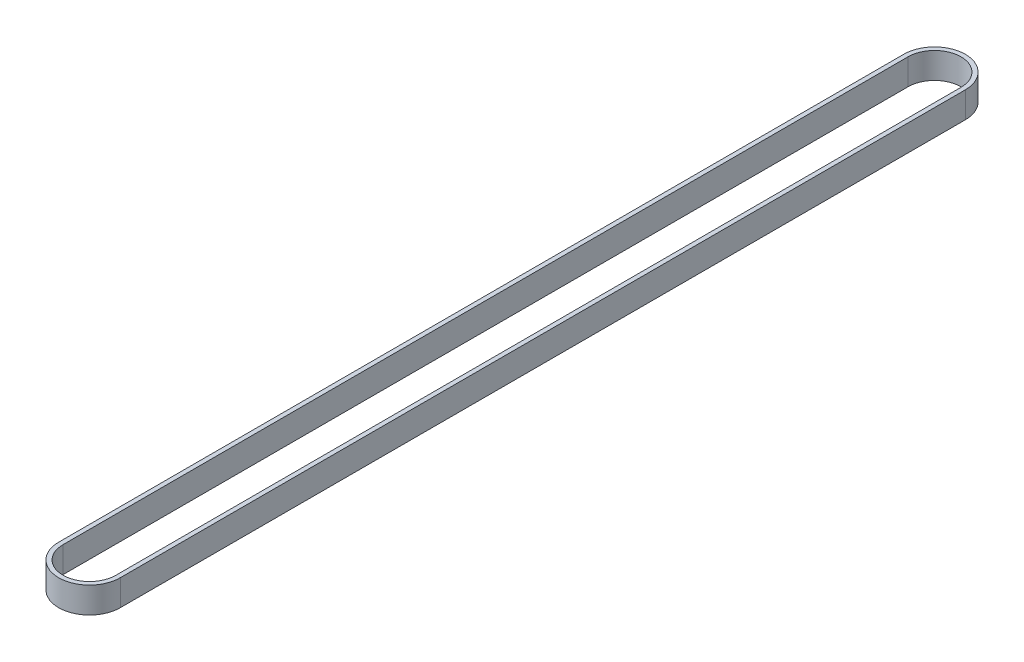
ISO-10303-21;
HEADER;
FILE_DESCRIPTION(('STEP AP214'),'2;1');
FILE_NAME('part.step','',(''),(''),'','','');
FILE_SCHEMA(('AUTOMOTIVE_DESIGN { 1 0 10303 214 1 1 1 1 }'));
ENDSEC;
DATA;
#1=APPLICATION_CONTEXT('core data for automotive mechanical design processes');
#2=APPLICATION_PROTOCOL_DEFINITION('international standard','automotive_design',2000,#1);
#3=PRODUCT_CONTEXT('',#1,'mechanical');
#4=PRODUCT('Part','Part','',(#3));
#5=PRODUCT_RELATED_PRODUCT_CATEGORY('part','',(#4));
#6=PRODUCT_DEFINITION_FORMATION('','',#4);
#7=PRODUCT_DEFINITION_CONTEXT('part definition',#1,'design');
#8=PRODUCT_DEFINITION('design','',#6,#7);
#9=PRODUCT_DEFINITION_SHAPE('','',#8);
#10=(LENGTH_UNIT() NAMED_UNIT(*) SI_UNIT(.MILLI.,.METRE.));
#11=(NAMED_UNIT(*) PLANE_ANGLE_UNIT() SI_UNIT($,.RADIAN.));
#12=(NAMED_UNIT(*) SI_UNIT($,.STERADIAN.) SOLID_ANGLE_UNIT());
#13=UNCERTAINTY_MEASURE_WITH_UNIT(LENGTH_MEASURE(1.E-05),#10,'distance_accuracy_value','');
#14=(GEOMETRIC_REPRESENTATION_CONTEXT(3) GLOBAL_UNCERTAINTY_ASSIGNED_CONTEXT((#13)) GLOBAL_UNIT_ASSIGNED_CONTEXT((#10,
#11,#12)) REPRESENTATION_CONTEXT('',''));
#15=CARTESIAN_POINT('',(0.,0.,0.));
#16=DIRECTION('',(0.,0.,1.));
#17=DIRECTION('',(1.,0.,0.));
#18=AXIS2_PLACEMENT_3D('',#15,#16,#17);
#19=CARTESIAN_POINT('',(0.,6.,97.55));
#20=DIRECTION('',(0.,1.,0.));
#21=DIRECTION('',(0.,0.,1.));
#22=AXIS2_PLACEMENT_3D('',#19,#20,#21);
#23=PLANE('',#22);
#24=CARTESIAN_POINT('',(0.,6.,97.55));
#25=DIRECTION('',(0.,1.,0.));
#26=DIRECTION('',(0.,0.,1.));
#27=AXIS2_PLACEMENT_3D('',#24,#25,#26);
#28=CIRCLE('',#27,7.11000000000002);
#29=CARTESIAN_POINT('',(-7.11000000000002,6.,97.55));
#30=VERTEX_POINT('',#29);
#31=CARTESIAN_POINT('',(7.11000000000002,6.,97.55));
#32=VERTEX_POINT('',#31);
#33=EDGE_CURVE('E157',#30,#32,#28,.T.);
#34=ORIENTED_EDGE('',*,*,#33,.T.);
#35=DIRECTION('',(0.,0.,-1.));
#36=VECTOR('',#35,1.);
#37=CARTESIAN_POINT('',(7.11000000000002,6.,97.55));
#38=LINE('',#37,#36);
#39=CARTESIAN_POINT('',(7.11,6.,-97.55));
#40=VERTEX_POINT('',#39);
#41=EDGE_CURVE('E161',#32,#40,#38,.T.);
#42=ORIENTED_EDGE('',*,*,#41,.T.);
#43=CARTESIAN_POINT('',(0.,6.,-97.55));
#44=DIRECTION('',(0.,1.,0.));
#45=DIRECTION('',(0.,0.,1.));
#46=AXIS2_PLACEMENT_3D('',#43,#44,#45);
#47=CIRCLE('',#46,7.11000000000002);
#48=CARTESIAN_POINT('',(-7.11000000000005,6.,-97.55));
#49=VERTEX_POINT('',#48);
#50=EDGE_CURVE('E165',#40,#49,#47,.T.);
#51=ORIENTED_EDGE('',*,*,#50,.T.);
#52=DIRECTION('',(0.,0.,1.));
#53=VECTOR('',#52,1.);
#54=CARTESIAN_POINT('',(-7.11000000000002,6.,97.55));
#55=LINE('',#54,#53);
#56=EDGE_CURVE('E168',#49,#30,#55,.T.);
#57=ORIENTED_EDGE('',*,*,#56,.T.);
#58=EDGE_LOOP('',(#34,#42,#51,#57));
#59=FACE_BOUND('',#58,.T.);
#60=DIRECTION('',(0.,0.,-1.));
#61=VECTOR('',#60,1.);
#62=CARTESIAN_POINT('',(6.10999999999998,6.,97.55));
#63=LINE('',#62,#61);
#64=CARTESIAN_POINT('',(6.10999999999998,6.,97.55));
#65=VERTEX_POINT('',#64);
#66=CARTESIAN_POINT('',(6.10999999999998,6.,-97.55));
#67=VERTEX_POINT('',#66);
#68=EDGE_CURVE('E118',#65,#67,#63,.T.);
#69=ORIENTED_EDGE('',*,*,#68,.F.);
#70=CARTESIAN_POINT('',(0.,6.,97.55));
#71=DIRECTION('',(0.,1.,0.));
#72=DIRECTION('',(0.,0.,1.));
#73=AXIS2_PLACEMENT_3D('',#70,#71,#72);
#74=CIRCLE('',#73,6.11);
#75=CARTESIAN_POINT('',(-6.11000000000002,6.,97.55));
#76=VERTEX_POINT('',#75);
#77=EDGE_CURVE('E109',#76,#65,#74,.T.);
#78=ORIENTED_EDGE('',*,*,#77,.F.);
#79=DIRECTION('',(0.,0.,1.));
#80=VECTOR('',#79,1.);
#81=CARTESIAN_POINT('',(-6.11000000000002,6.,97.55));
#82=LINE('',#81,#80);
#83=CARTESIAN_POINT('',(-6.11000000000002,6.,-97.55));
#84=VERTEX_POINT('',#83);
#85=EDGE_CURVE('E135',#84,#76,#82,.T.);
#86=ORIENTED_EDGE('',*,*,#85,.F.);
#87=CARTESIAN_POINT('',(0.,6.,-97.55));
#88=DIRECTION('',(0.,1.,0.));
#89=DIRECTION('',(0.,0.,1.));
#90=AXIS2_PLACEMENT_3D('',#87,#88,#89);
#91=CIRCLE('',#90,6.11);
#92=EDGE_CURVE('E131',#67,#84,#91,.T.);
#93=ORIENTED_EDGE('',*,*,#92,.F.);
#94=EDGE_LOOP('',(#69,#78,#86,#93));
#95=FACE_BOUND('',#94,.T.);
#96=ADVANCED_FACE('F43',(#59,#95),#23,.T.);
#97=CARTESIAN_POINT('',(0.,0.,97.55));
#98=DIRECTION('',(0.,1.,0.));
#99=DIRECTION('',(0.,0.,1.));
#100=AXIS2_PLACEMENT_3D('',#97,#98,#99);
#101=PLANE('',#100);
#102=CARTESIAN_POINT('',(0.,0.,97.55));
#103=DIRECTION('',(0.,1.,0.));
#104=DIRECTION('',(0.,0.,1.));
#105=AXIS2_PLACEMENT_3D('',#102,#103,#104);
#106=CIRCLE('',#105,7.11000000000002);
#107=CARTESIAN_POINT('',(-7.11000000000002,0.,97.55));
#108=VERTEX_POINT('',#107);
#109=CARTESIAN_POINT('',(7.11000000000002,0.,97.55));
#110=VERTEX_POINT('',#109);
#111=EDGE_CURVE('E127',#108,#110,#106,.T.);
#112=ORIENTED_EDGE('',*,*,#111,.F.);
#113=DIRECTION('',(0.,0.,1.));
#114=VECTOR('',#113,1.);
#115=CARTESIAN_POINT('',(-7.11000000000002,0.,97.55));
#116=LINE('',#115,#114);
#117=CARTESIAN_POINT('',(-7.11000000000005,0.,-97.55));
#118=VERTEX_POINT('',#117);
#119=EDGE_CURVE('E162',#118,#108,#116,.T.);
#120=ORIENTED_EDGE('',*,*,#119,.F.);
#121=CARTESIAN_POINT('',(0.,0.,-97.55));
#122=DIRECTION('',(0.,1.,0.));
#123=DIRECTION('',(0.,0.,1.));
#124=AXIS2_PLACEMENT_3D('',#121,#122,#123);
#125=CIRCLE('',#124,7.11000000000002);
#126=CARTESIAN_POINT('',(7.11,0.,-97.55));
#127=VERTEX_POINT('',#126);
#128=EDGE_CURVE('E178',#127,#118,#125,.T.);
#129=ORIENTED_EDGE('',*,*,#128,.F.);
#130=DIRECTION('',(0.,0.,-1.));
#131=VECTOR('',#130,1.);
#132=CARTESIAN_POINT('',(7.11000000000002,0.,97.55));
#133=LINE('',#132,#131);
#134=EDGE_CURVE('E175',#110,#127,#133,.T.);
#135=ORIENTED_EDGE('',*,*,#134,.F.);
#136=EDGE_LOOP('',(#112,#120,#129,#135));
#137=FACE_BOUND('',#136,.T.);
#138=CARTESIAN_POINT('',(0.,0.,97.55));
#139=DIRECTION('',(0.,1.,0.));
#140=DIRECTION('',(0.,0.,1.));
#141=AXIS2_PLACEMENT_3D('',#138,#139,#140);
#142=CIRCLE('',#141,6.11);
#143=CARTESIAN_POINT('',(-6.11000000000002,0.,97.55));
#144=VERTEX_POINT('',#143);
#145=CARTESIAN_POINT('',(6.10999999999998,0.,97.55));
#146=VERTEX_POINT('',#145);
#147=EDGE_CURVE('E67',#144,#146,#142,.T.);
#148=ORIENTED_EDGE('',*,*,#147,.T.);
#149=DIRECTION('',(0.,0.,-1.));
#150=VECTOR('',#149,1.);
#151=CARTESIAN_POINT('',(6.10999999999998,0.,97.55));
#152=LINE('',#151,#150);
#153=CARTESIAN_POINT('',(6.10999999999998,0.,-97.55));
#154=VERTEX_POINT('',#153);
#155=EDGE_CURVE('E125',#146,#154,#152,.T.);
#156=ORIENTED_EDGE('',*,*,#155,.T.);
#157=CARTESIAN_POINT('',(0.,0.,-97.55));
#158=DIRECTION('',(0.,1.,0.));
#159=DIRECTION('',(0.,0.,1.));
#160=AXIS2_PLACEMENT_3D('',#157,#158,#159);
#161=CIRCLE('',#160,6.11);
#162=CARTESIAN_POINT('',(-6.11000000000002,0.,-97.55));
#163=VERTEX_POINT('',#162);
#164=EDGE_CURVE('E144',#154,#163,#161,.T.);
#165=ORIENTED_EDGE('',*,*,#164,.T.);
#166=DIRECTION('',(0.,0.,1.));
#167=VECTOR('',#166,1.);
#168=CARTESIAN_POINT('',(-6.11000000000002,0.,97.55));
#169=LINE('',#168,#167);
#170=EDGE_CURVE('E119',#163,#144,#169,.T.);
#171=ORIENTED_EDGE('',*,*,#170,.T.);
#172=EDGE_LOOP('',(#148,#156,#165,#171));
#173=FACE_BOUND('',#172,.T.);
#174=ADVANCED_FACE('F201',(#137,#173),#101,.F.);
#175=CARTESIAN_POINT('',(0.,6.,97.55));
#176=DIRECTION('',(0.,-1.,0.));
#177=DIRECTION('',(0.,0.,-1.));
#178=AXIS2_PLACEMENT_3D('',#175,#176,#177);
#179=CYLINDRICAL_SURFACE('',#178,7.11000000000002);
#180=ORIENTED_EDGE('',*,*,#111,.T.);
#181=DIRECTION('',(0.,-1.,0.));
#182=VECTOR('',#181,1.);
#183=CARTESIAN_POINT('',(7.11000000000002,6.,97.55));
#184=LINE('',#183,#182);
#185=EDGE_CURVE('E11',#32,#110,#184,.T.);
#186=ORIENTED_EDGE('',*,*,#185,.F.);
#187=ORIENTED_EDGE('',*,*,#33,.F.);
#188=DIRECTION('',(0.,-1.,0.));
#189=VECTOR('',#188,1.);
#190=CARTESIAN_POINT('',(-7.11000000000002,6.,97.55));
#191=LINE('',#190,#189);
#192=EDGE_CURVE('E171',#30,#108,#191,.T.);
#193=ORIENTED_EDGE('',*,*,#192,.T.);
#194=EDGE_LOOP('',(#180,#186,#187,#193));
#195=FACE_BOUND('',#194,.T.);
#196=ADVANCED_FACE('F45',(#195),#179,.T.);
#197=CARTESIAN_POINT('',(7.11000000000002,6.,97.55));
#198=DIRECTION('',(-1.,0.,0.));
#199=DIRECTION('',(0.,0.,1.));
#200=AXIS2_PLACEMENT_3D('',#197,#198,#199);
#201=PLANE('',#200);
#202=ORIENTED_EDGE('',*,*,#134,.T.);
#203=DIRECTION('',(0.,-1.,0.));
#204=VECTOR('',#203,1.);
#205=CARTESIAN_POINT('',(7.11,6.,-97.55));
#206=LINE('',#205,#204);
#207=EDGE_CURVE('E52',#40,#127,#206,.T.);
#208=ORIENTED_EDGE('',*,*,#207,.F.);
#209=ORIENTED_EDGE('',*,*,#41,.F.);
#210=ORIENTED_EDGE('',*,*,#185,.T.);
#211=EDGE_LOOP('',(#202,#208,#209,#210));
#212=FACE_BOUND('',#211,.T.);
#213=ADVANCED_FACE('F211',(#212),#201,.F.);
#214=CARTESIAN_POINT('',(0.,6.,-97.55));
#215=DIRECTION('',(0.,-1.,0.));
#216=DIRECTION('',(0.,0.,-1.));
#217=AXIS2_PLACEMENT_3D('',#214,#215,#216);
#218=CYLINDRICAL_SURFACE('',#217,7.11000000000002);
#219=ORIENTED_EDGE('',*,*,#128,.T.);
#220=DIRECTION('',(0.,-1.,0.));
#221=VECTOR('',#220,1.);
#222=CARTESIAN_POINT('',(-7.11000000000005,6.,-97.55));
#223=LINE('',#222,#221);
#224=EDGE_CURVE('E186',#49,#118,#223,.T.);
#225=ORIENTED_EDGE('',*,*,#224,.F.);
#226=ORIENTED_EDGE('',*,*,#50,.F.);
#227=ORIENTED_EDGE('',*,*,#207,.T.);
#228=EDGE_LOOP('',(#219,#225,#226,#227));
#229=FACE_BOUND('',#228,.T.);
#230=ADVANCED_FACE('F195',(#229),#218,.T.);
#231=CARTESIAN_POINT('',(-7.11000000000002,6.,97.55));
#232=DIRECTION('',(1.,0.,0.));
#233=DIRECTION('',(0.,0.,-1.));
#234=AXIS2_PLACEMENT_3D('',#231,#232,#233);
#235=PLANE('',#234);
#236=ORIENTED_EDGE('',*,*,#119,.T.);
#237=ORIENTED_EDGE('',*,*,#192,.F.);
#238=ORIENTED_EDGE('',*,*,#56,.F.);
#239=ORIENTED_EDGE('',*,*,#224,.T.);
#240=EDGE_LOOP('',(#236,#237,#238,#239));
#241=FACE_BOUND('',#240,.T.);
#242=ADVANCED_FACE('F205',(#241),#235,.F.);
#243=CARTESIAN_POINT('',(0.,6.,97.55));
#244=DIRECTION('',(0.,-1.,0.));
#245=DIRECTION('',(0.,0.,-1.));
#246=AXIS2_PLACEMENT_3D('',#243,#244,#245);
#247=CYLINDRICAL_SURFACE('',#246,6.11);
#248=ORIENTED_EDGE('',*,*,#147,.F.);
#249=DIRECTION('',(0.,-1.,0.));
#250=VECTOR('',#249,1.);
#251=CARTESIAN_POINT('',(-6.11000000000002,6.,97.55));
#252=LINE('',#251,#250);
#253=EDGE_CURVE('E113',#76,#144,#252,.T.);
#254=ORIENTED_EDGE('',*,*,#253,.F.);
#255=ORIENTED_EDGE('',*,*,#77,.T.);
#256=DIRECTION('',(0.,-1.,0.));
#257=VECTOR('',#256,1.);
#258=CARTESIAN_POINT('',(6.10999999999998,6.,97.55));
#259=LINE('',#258,#257);
#260=EDGE_CURVE('E112',#65,#146,#259,.T.);
#261=ORIENTED_EDGE('',*,*,#260,.T.);
#262=EDGE_LOOP('',(#248,#254,#255,#261));
#263=FACE_BOUND('',#262,.T.);
#264=ADVANCED_FACE('F111',(#263),#247,.F.);
#265=CARTESIAN_POINT('',(6.10999999999998,6.,97.55));
#266=DIRECTION('',(-1.,0.,0.));
#267=DIRECTION('',(0.,0.,1.));
#268=AXIS2_PLACEMENT_3D('',#265,#266,#267);
#269=PLANE('',#268);
#270=ORIENTED_EDGE('',*,*,#155,.F.);
#271=ORIENTED_EDGE('',*,*,#260,.F.);
#272=ORIENTED_EDGE('',*,*,#68,.T.);
#273=DIRECTION('',(0.,-1.,0.));
#274=VECTOR('',#273,1.);
#275=CARTESIAN_POINT('',(6.10999999999998,6.,-97.55));
#276=LINE('',#275,#274);
#277=EDGE_CURVE('E128',#67,#154,#276,.T.);
#278=ORIENTED_EDGE('',*,*,#277,.T.);
#279=EDGE_LOOP('',(#270,#271,#272,#278));
#280=FACE_BOUND('',#279,.T.);
#281=ADVANCED_FACE('F122',(#280),#269,.T.);
#282=CARTESIAN_POINT('',(0.,6.,-97.55));
#283=DIRECTION('',(0.,-1.,0.));
#284=DIRECTION('',(0.,0.,-1.));
#285=AXIS2_PLACEMENT_3D('',#282,#283,#284);
#286=CYLINDRICAL_SURFACE('',#285,6.11);
#287=ORIENTED_EDGE('',*,*,#164,.F.);
#288=ORIENTED_EDGE('',*,*,#277,.F.);
#289=ORIENTED_EDGE('',*,*,#92,.T.);
#290=DIRECTION('',(0.,-1.,0.));
#291=VECTOR('',#290,1.);
#292=CARTESIAN_POINT('',(-6.11000000000002,6.,-97.55));
#293=LINE('',#292,#291);
#294=EDGE_CURVE('E59',#84,#163,#293,.T.);
#295=ORIENTED_EDGE('',*,*,#294,.T.);
#296=EDGE_LOOP('',(#287,#288,#289,#295));
#297=FACE_BOUND('',#296,.T.);
#298=ADVANCED_FACE('F234',(#297),#286,.F.);
#299=CARTESIAN_POINT('',(-6.11000000000002,6.,97.55));
#300=DIRECTION('',(1.,0.,0.));
#301=DIRECTION('',(0.,0.,-1.));
#302=AXIS2_PLACEMENT_3D('',#299,#300,#301);
#303=PLANE('',#302);
#304=ORIENTED_EDGE('',*,*,#170,.F.);
#305=ORIENTED_EDGE('',*,*,#294,.F.);
#306=ORIENTED_EDGE('',*,*,#85,.T.);
#307=ORIENTED_EDGE('',*,*,#253,.T.);
#308=EDGE_LOOP('',(#304,#305,#306,#307));
#309=FACE_BOUND('',#308,.T.);
#310=ADVANCED_FACE('F238',(#309),#303,.T.);
#311=CLOSED_SHELL('',(#96,#174,#196,#213,#230,#242,#264,#281,#298,#310));
#312=MANIFOLD_SOLID_BREP('B2',#311);
#313=ADVANCED_BREP_SHAPE_REPRESENTATION('',(#18,#312),#14);
#314=SHAPE_DEFINITION_REPRESENTATION(#9,#313);
ENDSEC;
END-ISO-10303-21;
